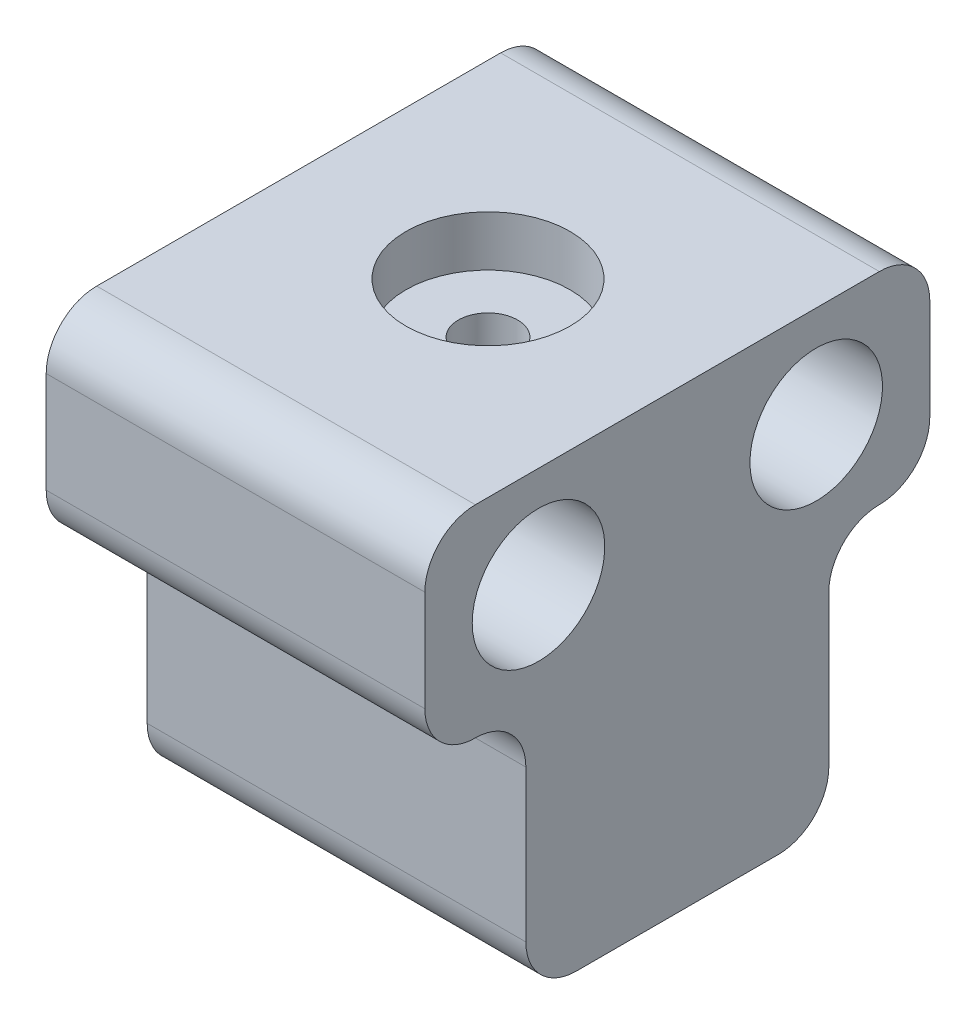
ISO-10303-21;
HEADER;
FILE_DESCRIPTION(('STEP AP214'),'2;1');
FILE_NAME('part.step','',(''),(''),'','','');
FILE_SCHEMA(('AUTOMOTIVE_DESIGN { 1 0 10303 214 1 1 1 1 }'));
ENDSEC;
DATA;
#1=APPLICATION_CONTEXT('core data for automotive mechanical design processes');
#2=APPLICATION_PROTOCOL_DEFINITION('international standard','automotive_design',2000,#1);
#3=PRODUCT_CONTEXT('',#1,'mechanical');
#4=PRODUCT('Part','Part','',(#3));
#5=PRODUCT_RELATED_PRODUCT_CATEGORY('part','',(#4));
#6=PRODUCT_DEFINITION_FORMATION('','',#4);
#7=PRODUCT_DEFINITION_CONTEXT('part definition',#1,'design');
#8=PRODUCT_DEFINITION('design','',#6,#7);
#9=PRODUCT_DEFINITION_SHAPE('','',#8);
#10=(LENGTH_UNIT() NAMED_UNIT(*) SI_UNIT(.MILLI.,.METRE.));
#11=(NAMED_UNIT(*) PLANE_ANGLE_UNIT() SI_UNIT($,.RADIAN.));
#12=(NAMED_UNIT(*) SI_UNIT($,.STERADIAN.) SOLID_ANGLE_UNIT());
#13=UNCERTAINTY_MEASURE_WITH_UNIT(LENGTH_MEASURE(1.E-05),#10,'distance_accuracy_value','');
#14=(GEOMETRIC_REPRESENTATION_CONTEXT(3) GLOBAL_UNCERTAINTY_ASSIGNED_CONTEXT((#13)) GLOBAL_UNIT_ASSIGNED_CONTEXT((#10,
#11,#12)) REPRESENTATION_CONTEXT('',''));
#15=CARTESIAN_POINT('',(0.,0.,0.));
#16=DIRECTION('',(0.,0.,1.));
#17=DIRECTION('',(1.,0.,0.));
#18=AXIS2_PLACEMENT_3D('',#15,#16,#17);
#19=CARTESIAN_POINT('',(0.,0.,0.));
#20=DIRECTION('',(0.,1.,0.));
#21=DIRECTION('',(0.,0.,1.));
#22=AXIS2_PLACEMENT_3D('',#19,#20,#21);
#23=PLANE('',#22);
#24=DIRECTION('',(0.,0.,-1.));
#25=VECTOR('',#24,1.);
#26=CARTESIAN_POINT('',(15.,0.,-8.11011904761905));
#27=LINE('',#26,#25);
#28=CARTESIAN_POINT('',(15.,0.,19.8898809523809));
#29=VERTEX_POINT('',#28);
#30=CARTESIAN_POINT('',(15.,0.,3.88988095238095));
#31=VERTEX_POINT('',#30);
#32=EDGE_CURVE('E332',#29,#31,#27,.T.);
#33=ORIENTED_EDGE('',*,*,#32,.F.);
#34=DIRECTION('',(-1.,0.,0.));
#35=VECTOR('',#34,1.);
#36=CARTESIAN_POINT('',(0.,0.,19.889880952381));
#37=LINE('',#36,#35);
#38=CARTESIAN_POINT('',(11.25,0.,19.889880952381));
#39=VERTEX_POINT('',#38);
#40=EDGE_CURVE('E367',#29,#39,#37,.T.);
#41=ORIENTED_EDGE('',*,*,#40,.T.);
#42=DIRECTION('',(0.,0.,1.));
#43=VECTOR('',#42,1.);
#44=CARTESIAN_POINT('',(11.25,0.,21.389880952381));
#45=LINE('',#44,#43);
#46=CARTESIAN_POINT('',(11.25,0.,3.88988095238096));
#47=VERTEX_POINT('',#46);
#48=EDGE_CURVE('E260',#47,#39,#45,.T.);
#49=ORIENTED_EDGE('',*,*,#48,.F.);
#50=DIRECTION('',(-1.,0.,0.));
#51=VECTOR('',#50,1.);
#52=CARTESIAN_POINT('',(0.,0.,3.88988095238096));
#53=LINE('',#52,#51);
#54=EDGE_CURVE('E351',#47,#31,#53,.F.);
#55=ORIENTED_EDGE('',*,*,#54,.T.);
#56=EDGE_LOOP('',(#33,#41,#49,#55));
#57=FACE_BOUND('',#56,.T.);
#58=ADVANCED_FACE('F34',(#57),#23,.F.);
#59=DIRECTION('',(0.,0.,-1.));
#60=VECTOR('',#59,1.);
#61=CARTESIAN_POINT('',(5.5,0.,21.389880952381));
#62=LINE('',#61,#60);
#63=CARTESIAN_POINT('',(5.5,0.,19.8898809523809));
#64=VERTEX_POINT('',#63);
#65=CARTESIAN_POINT('',(5.5,0.,18.389880952381));
#66=VERTEX_POINT('',#65);
#67=EDGE_CURVE('E266',#64,#66,#62,.T.);
#68=ORIENTED_EDGE('',*,*,#67,.F.);
#69=DIRECTION('',(-1.,0.,0.));
#70=VECTOR('',#69,1.);
#71=CARTESIAN_POINT('',(0.,0.,19.889880952381));
#72=LINE('',#71,#70);
#73=CARTESIAN_POINT('',(-5.5,0.,19.889880952381));
#74=VERTEX_POINT('',#73);
#75=EDGE_CURVE('E365',#64,#74,#72,.T.);
#76=ORIENTED_EDGE('',*,*,#75,.T.);
#77=DIRECTION('',(0.,0.,1.));
#78=VECTOR('',#77,1.);
#79=CARTESIAN_POINT('',(-5.5,0.,21.389880952381));
#80=LINE('',#79,#78);
#81=CARTESIAN_POINT('',(-5.5,0.,18.389880952381));
#82=VERTEX_POINT('',#81);
#83=EDGE_CURVE('E270',#82,#74,#80,.T.);
#84=ORIENTED_EDGE('',*,*,#83,.F.);
#85=DIRECTION('',(-1.,0.,0.));
#86=VECTOR('',#85,1.);
#87=CARTESIAN_POINT('',(-5.5,0.,18.389880952381));
#88=LINE('',#87,#86);
#89=EDGE_CURVE('E268',#66,#82,#88,.T.);
#90=ORIENTED_EDGE('',*,*,#89,.F.);
#91=EDGE_LOOP('',(#68,#76,#84,#90));
#92=FACE_BOUND('',#91,.T.);
#93=ADVANCED_FACE('F547',(#92),#23,.F.);
#94=DIRECTION('',(0.,0.,-1.));
#95=VECTOR('',#94,1.);
#96=CARTESIAN_POINT('',(-11.25,0.,21.389880952381));
#97=LINE('',#96,#95);
#98=CARTESIAN_POINT('',(-11.25,0.,19.8898809523809));
#99=VERTEX_POINT('',#98);
#100=CARTESIAN_POINT('',(-11.25,0.,3.88988095238096));
#101=VERTEX_POINT('',#100);
#102=EDGE_CURVE('E246',#99,#101,#97,.T.);
#103=ORIENTED_EDGE('',*,*,#102,.F.);
#104=DIRECTION('',(-1.,0.,0.));
#105=VECTOR('',#104,1.);
#106=CARTESIAN_POINT('',(0.,0.,19.889880952381));
#107=LINE('',#106,#105);
#108=CARTESIAN_POINT('',(-15.,0.,19.8898809523809));
#109=VERTEX_POINT('',#108);
#110=EDGE_CURVE('E363',#99,#109,#107,.T.);
#111=ORIENTED_EDGE('',*,*,#110,.T.);
#112=DIRECTION('',(0.,0.,1.));
#113=VECTOR('',#112,1.);
#114=CARTESIAN_POINT('',(-15.,0.,-8.11011904761905));
#115=LINE('',#114,#113);
#116=CARTESIAN_POINT('',(-15.,0.,3.88988095238096));
#117=VERTEX_POINT('',#116);
#118=EDGE_CURVE('E327',#117,#109,#115,.T.);
#119=ORIENTED_EDGE('',*,*,#118,.F.);
#120=DIRECTION('',(-1.,0.,0.));
#121=VECTOR('',#120,1.);
#122=CARTESIAN_POINT('',(0.,0.,3.88988095238096));
#123=LINE('',#122,#121);
#124=EDGE_CURVE('E361',#117,#101,#123,.F.);
#125=ORIENTED_EDGE('',*,*,#124,.T.);
#126=EDGE_LOOP('',(#103,#111,#119,#125));
#127=FACE_BOUND('',#126,.T.);
#128=ADVANCED_FACE('F563',(#127),#23,.F.);
#129=CARTESIAN_POINT('',(0.,0.,11.889880952381));
#130=DIRECTION('',(0.,1.,0.));
#131=DIRECTION('',(0.,0.,1.));
#132=AXIS2_PLACEMENT_3D('',#129,#130,#131);
#133=CYLINDRICAL_SURFACE('',#132,2.35);
#134=CARTESIAN_POINT('',(0.,22.,11.889880952381));
#135=DIRECTION('',(0.,-1.,0.));
#136=DIRECTION('',(0.,0.,-1.));
#137=AXIS2_PLACEMENT_3D('',#134,#135,#136);
#138=CIRCLE('',#137,2.35);
#139=CARTESIAN_POINT('',(0.,22.,9.53988095238095));
#140=VERTEX_POINT('',#139);
#141=EDGE_CURVE('E278',#140,#140,#138,.T.);
#142=ORIENTED_EDGE('',*,*,#141,.T.);
#143=EDGE_LOOP('',(#142));
#144=FACE_BOUND('',#143,.T.);
#145=CARTESIAN_POINT('',(0.,32.,11.889880952381));
#146=DIRECTION('',(0.,1.,0.));
#147=DIRECTION('',(0.,0.,1.));
#148=AXIS2_PLACEMENT_3D('',#145,#146,#147);
#149=CIRCLE('',#148,2.35);
#150=CARTESIAN_POINT('',(0.,32.,14.239880952381));
#151=VERTEX_POINT('',#150);
#152=EDGE_CURVE('E354',#151,#151,#149,.F.);
#153=ORIENTED_EDGE('',*,*,#152,.F.);
#154=EDGE_LOOP('',(#153));
#155=FACE_BOUND('',#154,.T.);
#156=ADVANCED_FACE('F613',(#144,#155),#133,.F.);
#157=DIRECTION('',(0.,0.,1.));
#158=VECTOR('',#157,1.);
#159=CARTESIAN_POINT('',(-5.5,0.,2.38988095238095));
#160=LINE('',#159,#158);
#161=CARTESIAN_POINT('',(-5.5,0.,3.88988095238096));
#162=VERTEX_POINT('',#161);
#163=CARTESIAN_POINT('',(-5.5,0.,5.38988095238095));
#164=VERTEX_POINT('',#163);
#165=EDGE_CURVE('E234',#162,#164,#160,.T.);
#166=ORIENTED_EDGE('',*,*,#165,.F.);
#167=DIRECTION('',(-1.,0.,0.));
#168=VECTOR('',#167,1.);
#169=CARTESIAN_POINT('',(0.,0.,3.88988095238096));
#170=LINE('',#169,#168);
#171=CARTESIAN_POINT('',(5.5,0.,3.88988095238095));
#172=VERTEX_POINT('',#171);
#173=EDGE_CURVE('E359',#162,#172,#170,.F.);
#174=ORIENTED_EDGE('',*,*,#173,.T.);
#175=DIRECTION('',(0.,0.,-1.));
#176=VECTOR('',#175,1.);
#177=CARTESIAN_POINT('',(5.5,0.,2.38988095238095));
#178=LINE('',#177,#176);
#179=CARTESIAN_POINT('',(5.5,0.,5.38988095238095));
#180=VERTEX_POINT('',#179);
#181=EDGE_CURVE('E258',#180,#172,#178,.T.);
#182=ORIENTED_EDGE('',*,*,#181,.F.);
#183=DIRECTION('',(1.,0.,0.));
#184=VECTOR('',#183,1.);
#185=CARTESIAN_POINT('',(-5.5,0.,5.38988095238095));
#186=LINE('',#185,#184);
#187=EDGE_CURVE('E245',#164,#180,#186,.T.);
#188=ORIENTED_EDGE('',*,*,#187,.F.);
#189=EDGE_LOOP('',(#166,#174,#182,#188));
#190=FACE_BOUND('',#189,.T.);
#191=ADVANCED_FACE('F257',(#190),#23,.F.);
#192=CARTESIAN_POINT('',(-15.,36.,-8.11011904761905));
#193=DIRECTION('',(1.,0.,0.));
#194=DIRECTION('',(0.,0.,-1.));
#195=AXIS2_PLACEMENT_3D('',#192,#193,#194);
#196=PLANE('',#195);
#197=CARTESIAN_POINT('',(-15.,28.,22.889880952381));
#198=DIRECTION('',(-1.,0.,0.));
#199=DIRECTION('',(0.,0.,1.));
#200=AXIS2_PLACEMENT_3D('',#197,#198,#199);
#201=CIRCLE('',#200,5.25);
#202=CARTESIAN_POINT('',(-15.,28.,28.139880952381));
#203=VERTEX_POINT('',#202);
#204=EDGE_CURVE('E474',#203,#203,#201,.T.);
#205=ORIENTED_EDGE('',*,*,#204,.F.);
#206=EDGE_LOOP('',(#205));
#207=FACE_BOUND('',#206,.T.);
#208=CARTESIAN_POINT('',(-15.,28.,0.889880952380954));
#209=DIRECTION('',(-1.,0.,0.));
#210=DIRECTION('',(0.,0.,1.));
#211=AXIS2_PLACEMENT_3D('',#208,#209,#210);
#212=CIRCLE('',#211,5.25);
#213=CARTESIAN_POINT('',(-15.,28.,6.13988095238095));
#214=VERTEX_POINT('',#213);
#215=EDGE_CURVE('E489',#214,#214,#212,.T.);
#216=ORIENTED_EDGE('',*,*,#215,.F.);
#217=EDGE_LOOP('',(#216));
#218=FACE_BOUND('',#217,.T.);
#219=ORIENTED_EDGE('',*,*,#118,.T.);
#220=CARTESIAN_POINT('',(-15.,4.,19.889880952381));
#221=DIRECTION('',(1.,0.,0.));
#222=DIRECTION('',(0.,0.,-1.));
#223=AXIS2_PLACEMENT_3D('',#220,#221,#222);
#224=CIRCLE('',#223,4.);
#225=CARTESIAN_POINT('',(-15.,4.,23.889880952381));
#226=VERTEX_POINT('',#225);
#227=EDGE_CURVE('E396',#109,#226,#224,.F.);
#228=ORIENTED_EDGE('',*,*,#227,.T.);
#229=DIRECTION('',(0.,-1.,0.));
#230=VECTOR('',#229,1.);
#231=CARTESIAN_POINT('',(-15.,0.,23.889880952381));
#232=LINE('',#231,#230);
#233=CARTESIAN_POINT('',(-15.,16.,23.8898809523809));
#234=VERTEX_POINT('',#233);
#235=EDGE_CURVE('E475',#234,#226,#232,.T.);
#236=ORIENTED_EDGE('',*,*,#235,.F.);
#237=CARTESIAN_POINT('',(-15.,16.,27.8898809523809));
#238=DIRECTION('',(1.,0.,0.));
#239=DIRECTION('',(0.,0.,-1.));
#240=AXIS2_PLACEMENT_3D('',#237,#238,#239);
#241=CIRCLE('',#240,4.);
#242=CARTESIAN_POINT('',(-15.,20.,27.889880952381));
#243=VERTEX_POINT('',#242);
#244=EDGE_CURVE('E43',#234,#243,#241,.T.);
#245=ORIENTED_EDGE('',*,*,#244,.T.);
#246=CARTESIAN_POINT('',(-15.,24.,27.889880952381));
#247=DIRECTION('',(1.,0.,0.));
#248=DIRECTION('',(0.,0.,-1.));
#249=AXIS2_PLACEMENT_3D('',#246,#247,#248);
#250=CIRCLE('',#249,4.);
#251=CARTESIAN_POINT('',(-15.,24.,31.889880952381));
#252=VERTEX_POINT('',#251);
#253=EDGE_CURVE('E386',#243,#252,#250,.F.);
#254=ORIENTED_EDGE('',*,*,#253,.T.);
#255=DIRECTION('',(0.,-1.,0.));
#256=VECTOR('',#255,1.);
#257=CARTESIAN_POINT('',(-15.,36.,31.889880952381));
#258=LINE('',#257,#256);
#259=CARTESIAN_POINT('',(-15.,32.,31.889880952381));
#260=VERTEX_POINT('',#259);
#261=EDGE_CURVE('E348',#260,#252,#258,.T.);
#262=ORIENTED_EDGE('',*,*,#261,.F.);
#263=CARTESIAN_POINT('',(-15.,32.,27.889880952381));
#264=DIRECTION('',(1.,0.,0.));
#265=DIRECTION('',(0.,0.,-1.));
#266=AXIS2_PLACEMENT_3D('',#263,#264,#265);
#267=CIRCLE('',#266,4.);
#268=CARTESIAN_POINT('',(-15.,36.,27.8898809523809));
#269=VERTEX_POINT('',#268);
#270=EDGE_CURVE('E388',#260,#269,#267,.F.);
#271=ORIENTED_EDGE('',*,*,#270,.T.);
#272=DIRECTION('',(0.,0.,1.));
#273=VECTOR('',#272,1.);
#274=CARTESIAN_POINT('',(-15.,36.,-8.11011904761905));
#275=LINE('',#274,#273);
#276=CARTESIAN_POINT('',(-15.,36.,-4.11011904761904));
#277=VERTEX_POINT('',#276);
#278=EDGE_CURVE('E328',#277,#269,#275,.T.);
#279=ORIENTED_EDGE('',*,*,#278,.F.);
#280=CARTESIAN_POINT('',(-15.,32.,-4.11011904761904));
#281=DIRECTION('',(1.,0.,0.));
#282=DIRECTION('',(0.,0.,-1.));
#283=AXIS2_PLACEMENT_3D('',#280,#281,#282);
#284=CIRCLE('',#283,4.);
#285=CARTESIAN_POINT('',(-15.,32.,-8.11011904761905));
#286=VERTEX_POINT('',#285);
#287=EDGE_CURVE('E390',#277,#286,#284,.F.);
#288=ORIENTED_EDGE('',*,*,#287,.T.);
#289=DIRECTION('',(0.,-1.,0.));
#290=VECTOR('',#289,1.);
#291=CARTESIAN_POINT('',(-15.,36.,-8.11011904761905));
#292=LINE('',#291,#290);
#293=CARTESIAN_POINT('',(-15.,24.,-8.11011904761905));
#294=VERTEX_POINT('',#293);
#295=EDGE_CURVE('E335',#286,#294,#292,.T.);
#296=ORIENTED_EDGE('',*,*,#295,.T.);
#297=CARTESIAN_POINT('',(-15.,24.,-4.11011904761904));
#298=DIRECTION('',(1.,0.,0.));
#299=DIRECTION('',(0.,0.,-1.));
#300=AXIS2_PLACEMENT_3D('',#297,#298,#299);
#301=CIRCLE('',#300,4.);
#302=CARTESIAN_POINT('',(-15.,20.,-4.11011904761904));
#303=VERTEX_POINT('',#302);
#304=EDGE_CURVE('E392',#294,#303,#301,.F.);
#305=ORIENTED_EDGE('',*,*,#304,.T.);
#306=CARTESIAN_POINT('',(-15.,16.,-4.11011904761904));
#307=DIRECTION('',(1.,0.,0.));
#308=DIRECTION('',(0.,0.,-1.));
#309=AXIS2_PLACEMENT_3D('',#306,#307,#308);
#310=CIRCLE('',#309,4.);
#311=CARTESIAN_POINT('',(-15.,16.,-0.110119047619045));
#312=VERTEX_POINT('',#311);
#313=EDGE_CURVE('E440',#303,#312,#310,.T.);
#314=ORIENTED_EDGE('',*,*,#313,.T.);
#315=DIRECTION('',(0.,1.,0.));
#316=VECTOR('',#315,1.);
#317=CARTESIAN_POINT('',(-15.,0.,-0.110119047619043));
#318=LINE('',#317,#316);
#319=CARTESIAN_POINT('',(-15.,4.,-0.110119047619043));
#320=VERTEX_POINT('',#319);
#321=EDGE_CURVE('E446',#320,#312,#318,.T.);
#322=ORIENTED_EDGE('',*,*,#321,.F.);
#323=CARTESIAN_POINT('',(-15.,4.,3.88988095238096));
#324=DIRECTION('',(1.,0.,0.));
#325=DIRECTION('',(0.,0.,-1.));
#326=AXIS2_PLACEMENT_3D('',#323,#324,#325);
#327=CIRCLE('',#326,4.);
#328=EDGE_CURVE('E394',#320,#117,#327,.F.);
#329=ORIENTED_EDGE('',*,*,#328,.T.);
#330=EDGE_LOOP('',(#219,#228,#236,#245,#254,#262,#271,#279,#288,#296,#305,#314,#322,#329));
#331=FACE_BOUND('',#330,.T.);
#332=ADVANCED_FACE('F565',(#207,#218,#331),#196,.F.);
#333=CARTESIAN_POINT('',(-15.,36.,31.889880952381));
#334=DIRECTION('',(0.,0.,-1.));
#335=DIRECTION('',(-1.,0.,0.));
#336=AXIS2_PLACEMENT_3D('',#333,#334,#335);
#337=PLANE('',#336);
#338=DIRECTION('',(0.,-1.,0.));
#339=VECTOR('',#338,1.);
#340=CARTESIAN_POINT('',(15.,36.,31.889880952381));
#341=LINE('',#340,#339);
#342=CARTESIAN_POINT('',(15.,32.,31.889880952381));
#343=VERTEX_POINT('',#342);
#344=CARTESIAN_POINT('',(15.,24.,31.889880952381));
#345=VERTEX_POINT('',#344);
#346=EDGE_CURVE('E345',#343,#345,#341,.T.);
#347=ORIENTED_EDGE('',*,*,#346,.F.);
#348=DIRECTION('',(1.,0.,0.));
#349=VECTOR('',#348,1.);
#350=CARTESIAN_POINT('',(-15.,32.,31.889880952381));
#351=LINE('',#350,#349);
#352=EDGE_CURVE('E438',#343,#260,#351,.F.);
#353=ORIENTED_EDGE('',*,*,#352,.T.);
#354=ORIENTED_EDGE('',*,*,#261,.T.);
#355=DIRECTION('',(-1.,0.,0.));
#356=VECTOR('',#355,1.);
#357=CARTESIAN_POINT('',(-15.,24.,31.889880952381));
#358=LINE('',#357,#356);
#359=EDGE_CURVE('E435',#252,#345,#358,.F.);
#360=ORIENTED_EDGE('',*,*,#359,.T.);
#361=EDGE_LOOP('',(#347,#353,#354,#360));
#362=FACE_BOUND('',#361,.T.);
#363=ADVANCED_FACE('F593',(#362),#337,.F.);
#364=CARTESIAN_POINT('',(15.,36.,-8.11011904761905));
#365=DIRECTION('',(-1.,0.,0.));
#366=DIRECTION('',(0.,0.,1.));
#367=AXIS2_PLACEMENT_3D('',#364,#365,#366);
#368=PLANE('',#367);
#369=CARTESIAN_POINT('',(15.,28.,22.8898809523809));
#370=DIRECTION('',(-1.,0.,0.));
#371=DIRECTION('',(0.,0.,1.));
#372=AXIS2_PLACEMENT_3D('',#369,#370,#371);
#373=CIRCLE('',#372,5.25);
#374=CARTESIAN_POINT('',(15.,28.,28.139880952381));
#375=VERTEX_POINT('',#374);
#376=EDGE_CURVE('E478',#375,#375,#373,.T.);
#377=ORIENTED_EDGE('',*,*,#376,.T.);
#378=EDGE_LOOP('',(#377));
#379=FACE_BOUND('',#378,.T.);
#380=CARTESIAN_POINT('',(15.,28.,0.889880952380951));
#381=DIRECTION('',(-1.,0.,0.));
#382=DIRECTION('',(0.,0.,1.));
#383=AXIS2_PLACEMENT_3D('',#380,#381,#382);
#384=CIRCLE('',#383,5.25);
#385=CARTESIAN_POINT('',(15.,28.,6.13988095238095));
#386=VERTEX_POINT('',#385);
#387=EDGE_CURVE('E485',#386,#386,#384,.T.);
#388=ORIENTED_EDGE('',*,*,#387,.T.);
#389=EDGE_LOOP('',(#388));
#390=FACE_BOUND('',#389,.T.);
#391=DIRECTION('',(0.,-1.,0.));
#392=VECTOR('',#391,1.);
#393=CARTESIAN_POINT('',(15.,0.,23.889880952381));
#394=LINE('',#393,#392);
#395=CARTESIAN_POINT('',(15.,16.,23.8898809523809));
#396=VERTEX_POINT('',#395);
#397=CARTESIAN_POINT('',(15.,4.,23.889880952381));
#398=VERTEX_POINT('',#397);
#399=EDGE_CURVE('E467',#396,#398,#394,.T.);
#400=ORIENTED_EDGE('',*,*,#399,.T.);
#401=CARTESIAN_POINT('',(15.,4.,19.889880952381));
#402=DIRECTION('',(-1.,0.,0.));
#403=DIRECTION('',(0.,0.,1.));
#404=AXIS2_PLACEMENT_3D('',#401,#402,#403);
#405=CIRCLE('',#404,4.);
#406=EDGE_CURVE('E412',#398,#29,#405,.F.);
#407=ORIENTED_EDGE('',*,*,#406,.T.);
#408=ORIENTED_EDGE('',*,*,#32,.T.);
#409=CARTESIAN_POINT('',(15.,4.,3.88988095238095));
#410=DIRECTION('',(-1.,0.,0.));
#411=DIRECTION('',(0.,0.,1.));
#412=AXIS2_PLACEMENT_3D('',#409,#410,#411);
#413=CIRCLE('',#412,4.);
#414=CARTESIAN_POINT('',(15.,4.,-0.110119047619046));
#415=VERTEX_POINT('',#414);
#416=EDGE_CURVE('E410',#31,#415,#413,.F.);
#417=ORIENTED_EDGE('',*,*,#416,.T.);
#418=DIRECTION('',(0.,1.,0.));
#419=VECTOR('',#418,1.);
#420=CARTESIAN_POINT('',(15.,0.,-0.110119047619046));
#421=LINE('',#420,#419);
#422=CARTESIAN_POINT('',(15.,16.,-0.110119047619047));
#423=VERTEX_POINT('',#422);
#424=EDGE_CURVE('E451',#415,#423,#421,.T.);
#425=ORIENTED_EDGE('',*,*,#424,.T.);
#426=CARTESIAN_POINT('',(15.,16.,-4.11011904761905));
#427=DIRECTION('',(-1.,0.,0.));
#428=DIRECTION('',(0.,0.,1.));
#429=AXIS2_PLACEMENT_3D('',#426,#427,#428);
#430=CIRCLE('',#429,4.);
#431=CARTESIAN_POINT('',(15.,20.,-4.11011904761904));
#432=VERTEX_POINT('',#431);
#433=EDGE_CURVE('E442',#423,#432,#430,.T.);
#434=ORIENTED_EDGE('',*,*,#433,.T.);
#435=CARTESIAN_POINT('',(15.,24.,-4.11011904761904));
#436=DIRECTION('',(-1.,0.,0.));
#437=DIRECTION('',(0.,0.,1.));
#438=AXIS2_PLACEMENT_3D('',#435,#436,#437);
#439=CIRCLE('',#438,4.);
#440=CARTESIAN_POINT('',(15.,24.,-8.11011904761905));
#441=VERTEX_POINT('',#440);
#442=EDGE_CURVE('E408',#432,#441,#439,.F.);
#443=ORIENTED_EDGE('',*,*,#442,.T.);
#444=DIRECTION('',(0.,-1.,0.));
#445=VECTOR('',#444,1.);
#446=CARTESIAN_POINT('',(15.,36.,-8.11011904761905));
#447=LINE('',#446,#445);
#448=CARTESIAN_POINT('',(15.,32.,-8.11011904761905));
#449=VERTEX_POINT('',#448);
#450=EDGE_CURVE('E342',#449,#441,#447,.T.);
#451=ORIENTED_EDGE('',*,*,#450,.F.);
#452=CARTESIAN_POINT('',(15.,32.,-4.11011904761904));
#453=DIRECTION('',(-1.,0.,0.));
#454=DIRECTION('',(0.,0.,1.));
#455=AXIS2_PLACEMENT_3D('',#452,#453,#454);
#456=CIRCLE('',#455,4.);
#457=CARTESIAN_POINT('',(15.,36.,-4.11011904761904));
#458=VERTEX_POINT('',#457);
#459=EDGE_CURVE('E406',#449,#458,#456,.F.);
#460=ORIENTED_EDGE('',*,*,#459,.T.);
#461=DIRECTION('',(0.,0.,-1.));
#462=VECTOR('',#461,1.);
#463=CARTESIAN_POINT('',(15.,36.,-8.11011904761905));
#464=LINE('',#463,#462);
#465=CARTESIAN_POINT('',(15.,36.,27.8898809523809));
#466=VERTEX_POINT('',#465);
#467=EDGE_CURVE('E331',#466,#458,#464,.T.);
#468=ORIENTED_EDGE('',*,*,#467,.F.);
#469=CARTESIAN_POINT('',(15.,32.,27.889880952381));
#470=DIRECTION('',(-1.,0.,0.));
#471=DIRECTION('',(0.,0.,1.));
#472=AXIS2_PLACEMENT_3D('',#469,#470,#471);
#473=CIRCLE('',#472,4.);
#474=EDGE_CURVE('E404',#466,#343,#473,.F.);
#475=ORIENTED_EDGE('',*,*,#474,.T.);
#476=ORIENTED_EDGE('',*,*,#346,.T.);
#477=CARTESIAN_POINT('',(15.,24.,27.889880952381));
#478=DIRECTION('',(-1.,0.,0.));
#479=DIRECTION('',(0.,0.,1.));
#480=AXIS2_PLACEMENT_3D('',#477,#478,#479);
#481=CIRCLE('',#480,4.);
#482=CARTESIAN_POINT('',(15.,20.,27.889880952381));
#483=VERTEX_POINT('',#482);
#484=EDGE_CURVE('E402',#345,#483,#481,.F.);
#485=ORIENTED_EDGE('',*,*,#484,.T.);
#486=CARTESIAN_POINT('',(15.,16.,27.8898809523809));
#487=DIRECTION('',(-1.,0.,0.));
#488=DIRECTION('',(0.,0.,1.));
#489=AXIS2_PLACEMENT_3D('',#486,#487,#488);
#490=CIRCLE('',#489,4.);
#491=EDGE_CURVE('E11',#483,#396,#490,.T.);
#492=ORIENTED_EDGE('',*,*,#491,.T.);
#493=EDGE_LOOP('',(#400,#407,#408,#417,#425,#434,#443,#451,#460,#468,#475,#476,#485,#492));
#494=FACE_BOUND('',#493,.T.);
#495=ADVANCED_FACE('F466',(#379,#390,#494),#368,.F.);
#496=CARTESIAN_POINT('',(-15.,36.,-8.11011904761905));
#497=DIRECTION('',(0.,0.,1.));
#498=DIRECTION('',(1.,0.,0.));
#499=AXIS2_PLACEMENT_3D('',#496,#497,#498);
#500=PLANE('',#499);
#501=ORIENTED_EDGE('',*,*,#450,.T.);
#502=DIRECTION('',(-1.,0.,0.));
#503=VECTOR('',#502,1.);
#504=CARTESIAN_POINT('',(-15.,24.,-8.11011904761905));
#505=LINE('',#504,#503);
#506=EDGE_CURVE('E427',#441,#294,#505,.T.);
#507=ORIENTED_EDGE('',*,*,#506,.T.);
#508=ORIENTED_EDGE('',*,*,#295,.F.);
#509=DIRECTION('',(-1.,0.,0.));
#510=VECTOR('',#509,1.);
#511=CARTESIAN_POINT('',(15.,32.,-8.11011904761905));
#512=LINE('',#511,#510);
#513=EDGE_CURVE('E425',#286,#449,#512,.F.);
#514=ORIENTED_EDGE('',*,*,#513,.T.);
#515=EDGE_LOOP('',(#501,#507,#508,#514));
#516=FACE_BOUND('',#515,.T.);
#517=ADVANCED_FACE('F578',(#516),#500,.F.);
#518=CARTESIAN_POINT('',(0.,36.,0.));
#519=DIRECTION('',(0.,1.,0.));
#520=DIRECTION('',(0.,0.,1.));
#521=AXIS2_PLACEMENT_3D('',#518,#519,#520);
#522=PLANE('',#521);
#523=CARTESIAN_POINT('',(0.,36.,11.889880952381));
#524=DIRECTION('',(0.,1.,0.));
#525=DIRECTION('',(0.,0.,1.));
#526=AXIS2_PLACEMENT_3D('',#523,#524,#525);
#527=CIRCLE('',#526,6.5);
#528=CARTESIAN_POINT('',(0.,36.,18.389880952381));
#529=VERTEX_POINT('',#528);
#530=EDGE_CURVE('E488',#529,#529,#527,.T.);
#531=ORIENTED_EDGE('',*,*,#530,.F.);
#532=EDGE_LOOP('',(#531));
#533=FACE_BOUND('',#532,.T.);
#534=ORIENTED_EDGE('',*,*,#467,.T.);
#535=DIRECTION('',(-1.,0.,0.));
#536=VECTOR('',#535,1.);
#537=CARTESIAN_POINT('',(-15.,36.,-4.11011904761904));
#538=LINE('',#537,#536);
#539=EDGE_CURVE('E432',#458,#277,#538,.T.);
#540=ORIENTED_EDGE('',*,*,#539,.T.);
#541=ORIENTED_EDGE('',*,*,#278,.T.);
#542=DIRECTION('',(1.,0.,0.));
#543=VECTOR('',#542,1.);
#544=CARTESIAN_POINT('',(15.,36.,27.889880952381));
#545=LINE('',#544,#543);
#546=EDGE_CURVE('E429',#269,#466,#545,.T.);
#547=ORIENTED_EDGE('',*,*,#546,.T.);
#548=EDGE_LOOP('',(#534,#540,#541,#547));
#549=FACE_BOUND('',#548,.T.);
#550=ADVANCED_FACE('F586',(#533,#549),#522,.T.);
#551=CARTESIAN_POINT('',(-11.25,0.,21.389880952381));
#552=DIRECTION('',(1.,0.,0.));
#553=DIRECTION('',(0.,0.,-1.));
#554=AXIS2_PLACEMENT_3D('',#551,#552,#553);
#555=PLANE('',#554);
#556=DIRECTION('',(0.,1.,0.));
#557=VECTOR('',#556,1.);
#558=CARTESIAN_POINT('',(-11.25,0.,21.389880952381));
#559=LINE('',#558,#557);
#560=CARTESIAN_POINT('',(-11.25,0.291900756452168,21.389880952381));
#561=VERTEX_POINT('',#560);
#562=CARTESIAN_POINT('',(-11.25,22.,21.389880952381));
#563=VERTEX_POINT('',#562);
#564=EDGE_CURVE('E273',#561,#563,#559,.T.);
#565=ORIENTED_EDGE('',*,*,#564,.F.);
#566=CARTESIAN_POINT('',(-11.25,4.,19.889880952381));
#567=DIRECTION('',(1.,0.,0.));
#568=DIRECTION('',(0.,0.,-1.));
#569=AXIS2_PLACEMENT_3D('',#566,#567,#568);
#570=CIRCLE('',#569,4.);
#571=EDGE_CURVE('E384',#561,#99,#570,.T.);
#572=ORIENTED_EDGE('',*,*,#571,.T.);
#573=ORIENTED_EDGE('',*,*,#102,.T.);
#574=CARTESIAN_POINT('',(-11.25,4.,3.88988095238096));
#575=DIRECTION('',(1.,0.,0.));
#576=DIRECTION('',(0.,0.,-1.));
#577=AXIS2_PLACEMENT_3D('',#574,#575,#576);
#578=CIRCLE('',#577,4.);
#579=CARTESIAN_POINT('',(-11.25,0.29190075645217,2.38988095238095));
#580=VERTEX_POINT('',#579);
#581=EDGE_CURVE('E382',#101,#580,#578,.T.);
#582=ORIENTED_EDGE('',*,*,#581,.T.);
#583=DIRECTION('',(0.,1.,0.));
#584=VECTOR('',#583,1.);
#585=CARTESIAN_POINT('',(-11.25,0.,2.38988095238095));
#586=LINE('',#585,#584);
#587=CARTESIAN_POINT('',(-11.25,22.,2.38988095238095));
#588=VERTEX_POINT('',#587);
#589=EDGE_CURVE('E325',#580,#588,#586,.T.);
#590=ORIENTED_EDGE('',*,*,#589,.T.);
#591=DIRECTION('',(0.,0.,-1.));
#592=VECTOR('',#591,1.);
#593=CARTESIAN_POINT('',(-11.25,22.,21.389880952381));
#594=LINE('',#593,#592);
#595=EDGE_CURVE('E274',#563,#588,#594,.T.);
#596=ORIENTED_EDGE('',*,*,#595,.F.);
#597=EDGE_LOOP('',(#565,#572,#573,#582,#590,#596));
#598=FACE_BOUND('',#597,.T.);
#599=ADVANCED_FACE('F500',(#598),#555,.T.);
#600=CARTESIAN_POINT('',(-11.25,0.,2.38988095238095));
#601=DIRECTION('',(0.,0.,1.));
#602=DIRECTION('',(1.,0.,0.));
#603=AXIS2_PLACEMENT_3D('',#600,#601,#602);
#604=PLANE('',#603);
#605=ORIENTED_EDGE('',*,*,#589,.F.);
#606=DIRECTION('',(-1.,0.,0.));
#607=VECTOR('',#606,1.);
#608=CARTESIAN_POINT('',(-11.25,0.29190075645217,2.38988095238095));
#609=LINE('',#608,#607);
#610=CARTESIAN_POINT('',(-5.5,0.29190075645217,2.38988095238095));
#611=VERTEX_POINT('',#610);
#612=EDGE_CURVE('E59',#580,#611,#609,.F.);
#613=ORIENTED_EDGE('',*,*,#612,.T.);
#614=DIRECTION('',(0.,1.,0.));
#615=VECTOR('',#614,1.);
#616=CARTESIAN_POINT('',(-5.5,0.,2.38988095238095));
#617=LINE('',#616,#615);
#618=CARTESIAN_POINT('',(-5.5,22.,2.38988095238095));
#619=VERTEX_POINT('',#618);
#620=EDGE_CURVE('E253',#611,#619,#617,.T.);
#621=ORIENTED_EDGE('',*,*,#620,.T.);
#622=DIRECTION('',(1.,0.,0.));
#623=VECTOR('',#622,1.);
#624=CARTESIAN_POINT('',(-11.25,22.,2.38988095238095));
#625=LINE('',#624,#623);
#626=EDGE_CURVE('E277',#588,#619,#625,.T.);
#627=ORIENTED_EDGE('',*,*,#626,.F.);
#628=EDGE_LOOP('',(#605,#613,#621,#627));
#629=FACE_BOUND('',#628,.T.);
#630=ADVANCED_FACE('F763',(#629),#604,.T.);
#631=CARTESIAN_POINT('',(-5.5,0.,2.38988095238095));
#632=DIRECTION('',(-1.,0.,0.));
#633=DIRECTION('',(0.,0.,1.));
#634=AXIS2_PLACEMENT_3D('',#631,#632,#633);
#635=PLANE('',#634);
#636=ORIENTED_EDGE('',*,*,#620,.F.);
#637=CARTESIAN_POINT('',(-5.5,4.,3.88988095238096));
#638=DIRECTION('',(-1.,0.,0.));
#639=DIRECTION('',(0.,0.,1.));
#640=AXIS2_PLACEMENT_3D('',#637,#638,#639);
#641=CIRCLE('',#640,4.);
#642=EDGE_CURVE('E241',#611,#162,#641,.T.);
#643=ORIENTED_EDGE('',*,*,#642,.T.);
#644=ORIENTED_EDGE('',*,*,#165,.T.);
#645=DIRECTION('',(0.,1.,0.));
#646=VECTOR('',#645,1.);
#647=CARTESIAN_POINT('',(-5.5,0.,5.38988095238095));
#648=LINE('',#647,#646);
#649=CARTESIAN_POINT('',(-5.5,22.,5.38988095238095));
#650=VERTEX_POINT('',#649);
#651=EDGE_CURVE('E238',#164,#650,#648,.T.);
#652=ORIENTED_EDGE('',*,*,#651,.T.);
#653=DIRECTION('',(0.,0.,1.));
#654=VECTOR('',#653,1.);
#655=CARTESIAN_POINT('',(-5.5,22.,2.38988095238095));
#656=LINE('',#655,#654);
#657=EDGE_CURVE('E281',#619,#650,#656,.T.);
#658=ORIENTED_EDGE('',*,*,#657,.F.);
#659=EDGE_LOOP('',(#636,#643,#644,#652,#658));
#660=FACE_BOUND('',#659,.T.);
#661=ADVANCED_FACE('F236',(#660),#635,.T.);
#662=CARTESIAN_POINT('',(-5.5,0.,5.38988095238095));
#663=DIRECTION('',(0.,0.,1.));
#664=DIRECTION('',(1.,0.,0.));
#665=AXIS2_PLACEMENT_3D('',#662,#663,#664);
#666=PLANE('',#665);
#667=DIRECTION('',(1.,0.,0.));
#668=VECTOR('',#667,1.);
#669=CARTESIAN_POINT('',(-5.5,22.,5.38988095238095));
#670=LINE('',#669,#668);
#671=CARTESIAN_POINT('',(5.5,22.,5.38988095238095));
#672=VERTEX_POINT('',#671);
#673=EDGE_CURVE('E252',#650,#672,#670,.T.);
#674=ORIENTED_EDGE('',*,*,#673,.F.);
#675=ORIENTED_EDGE('',*,*,#651,.F.);
#676=ORIENTED_EDGE('',*,*,#187,.T.);
#677=DIRECTION('',(0.,1.,0.));
#678=VECTOR('',#677,1.);
#679=CARTESIAN_POINT('',(5.5,0.,5.38988095238095));
#680=LINE('',#679,#678);
#681=EDGE_CURVE('E254',#180,#672,#680,.T.);
#682=ORIENTED_EDGE('',*,*,#681,.T.);
#683=EDGE_LOOP('',(#674,#675,#676,#682));
#684=FACE_BOUND('',#683,.T.);
#685=ADVANCED_FACE('F249',(#684),#666,.T.);
#686=CARTESIAN_POINT('',(5.5,0.,2.38988095238095));
#687=DIRECTION('',(1.,0.,0.));
#688=DIRECTION('',(0.,0.,-1.));
#689=AXIS2_PLACEMENT_3D('',#686,#687,#688);
#690=PLANE('',#689);
#691=ORIENTED_EDGE('',*,*,#181,.T.);
#692=CARTESIAN_POINT('',(5.5,4.,3.88988095238095));
#693=DIRECTION('',(1.,0.,0.));
#694=DIRECTION('',(0.,0.,-1.));
#695=AXIS2_PLACEMENT_3D('',#692,#693,#694);
#696=CIRCLE('',#695,4.);
#697=CARTESIAN_POINT('',(5.5,0.29190075645217,2.38988095238095));
#698=VERTEX_POINT('',#697);
#699=EDGE_CURVE('E51',#172,#698,#696,.T.);
#700=ORIENTED_EDGE('',*,*,#699,.T.);
#701=DIRECTION('',(0.,1.,0.));
#702=VECTOR('',#701,1.);
#703=CARTESIAN_POINT('',(5.5,0.,2.38988095238095));
#704=LINE('',#703,#702);
#705=CARTESIAN_POINT('',(5.5,22.,2.38988095238095));
#706=VERTEX_POINT('',#705);
#707=EDGE_CURVE('E321',#698,#706,#704,.T.);
#708=ORIENTED_EDGE('',*,*,#707,.T.);
#709=DIRECTION('',(0.,0.,-1.));
#710=VECTOR('',#709,1.);
#711=CARTESIAN_POINT('',(5.5,22.,2.38988095238095));
#712=LINE('',#711,#710);
#713=EDGE_CURVE('E284',#672,#706,#712,.T.);
#714=ORIENTED_EDGE('',*,*,#713,.F.);
#715=ORIENTED_EDGE('',*,*,#681,.F.);
#716=EDGE_LOOP('',(#691,#700,#708,#714,#715));
#717=FACE_BOUND('',#716,.T.);
#718=ADVANCED_FACE('F508',(#717),#690,.T.);
#719=CARTESIAN_POINT('',(5.5,0.,2.38988095238095));
#720=DIRECTION('',(0.,0.,1.));
#721=DIRECTION('',(1.,0.,0.));
#722=AXIS2_PLACEMENT_3D('',#719,#720,#721);
#723=PLANE('',#722);
#724=ORIENTED_EDGE('',*,*,#707,.F.);
#725=DIRECTION('',(-1.,0.,0.));
#726=VECTOR('',#725,1.);
#727=CARTESIAN_POINT('',(5.5,0.291900756452169,2.38988095238095));
#728=LINE('',#727,#726);
#729=CARTESIAN_POINT('',(11.25,0.29190075645217,2.38988095238095));
#730=VERTEX_POINT('',#729);
#731=EDGE_CURVE('E423',#698,#730,#728,.F.);
#732=ORIENTED_EDGE('',*,*,#731,.T.);
#733=DIRECTION('',(0.,1.,0.));
#734=VECTOR('',#733,1.);
#735=CARTESIAN_POINT('',(11.25,0.,2.38988095238095));
#736=LINE('',#735,#734);
#737=CARTESIAN_POINT('',(11.25,22.,2.38988095238095));
#738=VERTEX_POINT('',#737);
#739=EDGE_CURVE('E319',#730,#738,#736,.T.);
#740=ORIENTED_EDGE('',*,*,#739,.T.);
#741=DIRECTION('',(1.,0.,0.));
#742=VECTOR('',#741,1.);
#743=CARTESIAN_POINT('',(5.5,22.,2.38988095238095));
#744=LINE('',#743,#742);
#745=EDGE_CURVE('E287',#706,#738,#744,.T.);
#746=ORIENTED_EDGE('',*,*,#745,.F.);
#747=EDGE_LOOP('',(#724,#732,#740,#746));
#748=FACE_BOUND('',#747,.T.);
#749=ADVANCED_FACE('F515',(#748),#723,.T.);
#750=CARTESIAN_POINT('',(11.25,0.,21.389880952381));
#751=DIRECTION('',(-1.,0.,0.));
#752=DIRECTION('',(0.,0.,1.));
#753=AXIS2_PLACEMENT_3D('',#750,#751,#752);
#754=PLANE('',#753);
#755=ORIENTED_EDGE('',*,*,#48,.T.);
#756=CARTESIAN_POINT('',(11.25,4.,19.889880952381));
#757=DIRECTION('',(-1.,0.,0.));
#758=DIRECTION('',(0.,0.,1.));
#759=AXIS2_PLACEMENT_3D('',#756,#757,#758);
#760=CIRCLE('',#759,4.);
#761=CARTESIAN_POINT('',(11.25,0.291900756452168,21.389880952381));
#762=VERTEX_POINT('',#761);
#763=EDGE_CURVE('E372',#39,#762,#760,.T.);
#764=ORIENTED_EDGE('',*,*,#763,.T.);
#765=DIRECTION('',(0.,1.,0.));
#766=VECTOR('',#765,1.);
#767=CARTESIAN_POINT('',(11.25,0.,21.389880952381));
#768=LINE('',#767,#766);
#769=CARTESIAN_POINT('',(11.25,22.,21.389880952381));
#770=VERTEX_POINT('',#769);
#771=EDGE_CURVE('E317',#762,#770,#768,.T.);
#772=ORIENTED_EDGE('',*,*,#771,.T.);
#773=DIRECTION('',(0.,0.,1.));
#774=VECTOR('',#773,1.);
#775=CARTESIAN_POINT('',(11.25,22.,21.389880952381));
#776=LINE('',#775,#774);
#777=EDGE_CURVE('E290',#738,#770,#776,.T.);
#778=ORIENTED_EDGE('',*,*,#777,.F.);
#779=ORIENTED_EDGE('',*,*,#739,.F.);
#780=CARTESIAN_POINT('',(11.25,4.,3.88988095238095));
#781=DIRECTION('',(-1.,0.,0.));
#782=DIRECTION('',(0.,0.,1.));
#783=AXIS2_PLACEMENT_3D('',#780,#781,#782);
#784=CIRCLE('',#783,4.);
#785=EDGE_CURVE('E370',#730,#47,#784,.T.);
#786=ORIENTED_EDGE('',*,*,#785,.T.);
#787=EDGE_LOOP('',(#755,#764,#772,#778,#779,#786));
#788=FACE_BOUND('',#787,.T.);
#789=ADVANCED_FACE('F519',(#788),#754,.T.);
#790=CARTESIAN_POINT('',(5.5,0.,21.389880952381));
#791=DIRECTION('',(0.,0.,-1.));
#792=DIRECTION('',(-1.,0.,0.));
#793=AXIS2_PLACEMENT_3D('',#790,#791,#792);
#794=PLANE('',#793);
#795=ORIENTED_EDGE('',*,*,#771,.F.);
#796=DIRECTION('',(-1.,0.,0.));
#797=VECTOR('',#796,1.);
#798=CARTESIAN_POINT('',(11.25,0.291900756452168,21.389880952381));
#799=LINE('',#798,#797);
#800=CARTESIAN_POINT('',(5.5,0.291900756452168,21.389880952381));
#801=VERTEX_POINT('',#800);
#802=EDGE_CURVE('E374',#762,#801,#799,.T.);
#803=ORIENTED_EDGE('',*,*,#802,.T.);
#804=DIRECTION('',(0.,1.,0.));
#805=VECTOR('',#804,1.);
#806=CARTESIAN_POINT('',(5.5,0.,21.389880952381));
#807=LINE('',#806,#805);
#808=CARTESIAN_POINT('',(5.5,22.,21.389880952381));
#809=VERTEX_POINT('',#808);
#810=EDGE_CURVE('E315',#801,#809,#807,.T.);
#811=ORIENTED_EDGE('',*,*,#810,.T.);
#812=DIRECTION('',(-1.,0.,0.));
#813=VECTOR('',#812,1.);
#814=CARTESIAN_POINT('',(5.5,22.,21.389880952381));
#815=LINE('',#814,#813);
#816=EDGE_CURVE('E293',#770,#809,#815,.T.);
#817=ORIENTED_EDGE('',*,*,#816,.F.);
#818=EDGE_LOOP('',(#795,#803,#811,#817));
#819=FACE_BOUND('',#818,.T.);
#820=ADVANCED_FACE('F535',(#819),#794,.T.);
#821=CARTESIAN_POINT('',(5.5,0.,21.389880952381));
#822=DIRECTION('',(1.,0.,0.));
#823=DIRECTION('',(0.,0.,-1.));
#824=AXIS2_PLACEMENT_3D('',#821,#822,#823);
#825=PLANE('',#824);
#826=ORIENTED_EDGE('',*,*,#810,.F.);
#827=CARTESIAN_POINT('',(5.5,4.,19.889880952381));
#828=DIRECTION('',(1.,0.,0.));
#829=DIRECTION('',(0.,0.,-1.));
#830=AXIS2_PLACEMENT_3D('',#827,#828,#829);
#831=CIRCLE('',#830,4.);
#832=EDGE_CURVE('E376',#801,#64,#831,.T.);
#833=ORIENTED_EDGE('',*,*,#832,.T.);
#834=ORIENTED_EDGE('',*,*,#67,.T.);
#835=DIRECTION('',(0.,1.,0.));
#836=VECTOR('',#835,1.);
#837=CARTESIAN_POINT('',(5.5,0.,18.389880952381));
#838=LINE('',#837,#836);
#839=CARTESIAN_POINT('',(5.5,22.,18.389880952381));
#840=VERTEX_POINT('',#839);
#841=EDGE_CURVE('E312',#66,#840,#838,.T.);
#842=ORIENTED_EDGE('',*,*,#841,.T.);
#843=DIRECTION('',(0.,0.,-1.));
#844=VECTOR('',#843,1.);
#845=CARTESIAN_POINT('',(5.5,22.,21.389880952381));
#846=LINE('',#845,#844);
#847=EDGE_CURVE('E296',#809,#840,#846,.T.);
#848=ORIENTED_EDGE('',*,*,#847,.F.);
#849=EDGE_LOOP('',(#826,#833,#834,#842,#848));
#850=FACE_BOUND('',#849,.T.);
#851=ADVANCED_FACE('F542',(#850),#825,.T.);
#852=CARTESIAN_POINT('',(-5.5,0.,18.389880952381));
#853=DIRECTION('',(0.,0.,-1.));
#854=DIRECTION('',(-1.,0.,0.));
#855=AXIS2_PLACEMENT_3D('',#852,#853,#854);
#856=PLANE('',#855);
#857=DIRECTION('',(-1.,0.,0.));
#858=VECTOR('',#857,1.);
#859=CARTESIAN_POINT('',(-5.5,22.,18.389880952381));
#860=LINE('',#859,#858);
#861=CARTESIAN_POINT('',(-5.5,22.,18.389880952381));
#862=VERTEX_POINT('',#861);
#863=EDGE_CURVE('E298',#840,#862,#860,.T.);
#864=ORIENTED_EDGE('',*,*,#863,.F.);
#865=ORIENTED_EDGE('',*,*,#841,.F.);
#866=ORIENTED_EDGE('',*,*,#89,.T.);
#867=DIRECTION('',(0.,1.,0.));
#868=VECTOR('',#867,1.);
#869=CARTESIAN_POINT('',(-5.5,0.,18.389880952381));
#870=LINE('',#869,#868);
#871=EDGE_CURVE('E309',#82,#862,#870,.T.);
#872=ORIENTED_EDGE('',*,*,#871,.T.);
#873=EDGE_LOOP('',(#864,#865,#866,#872));
#874=FACE_BOUND('',#873,.T.);
#875=ADVANCED_FACE('F552',(#874),#856,.T.);
#876=CARTESIAN_POINT('',(-5.5,0.,21.389880952381));
#877=DIRECTION('',(-1.,0.,0.));
#878=DIRECTION('',(0.,0.,1.));
#879=AXIS2_PLACEMENT_3D('',#876,#877,#878);
#880=PLANE('',#879);
#881=ORIENTED_EDGE('',*,*,#83,.T.);
#882=CARTESIAN_POINT('',(-5.5,4.,19.889880952381));
#883=DIRECTION('',(-1.,0.,0.));
#884=DIRECTION('',(0.,0.,1.));
#885=AXIS2_PLACEMENT_3D('',#882,#883,#884);
#886=CIRCLE('',#885,4.);
#887=CARTESIAN_POINT('',(-5.5,0.291900756452168,21.389880952381));
#888=VERTEX_POINT('',#887);
#889=EDGE_CURVE('E378',#74,#888,#886,.T.);
#890=ORIENTED_EDGE('',*,*,#889,.T.);
#891=DIRECTION('',(0.,1.,0.));
#892=VECTOR('',#891,1.);
#893=CARTESIAN_POINT('',(-5.5,0.,21.389880952381));
#894=LINE('',#893,#892);
#895=CARTESIAN_POINT('',(-5.5,22.,21.389880952381));
#896=VERTEX_POINT('',#895);
#897=EDGE_CURVE('E307',#888,#896,#894,.T.);
#898=ORIENTED_EDGE('',*,*,#897,.T.);
#899=DIRECTION('',(0.,0.,1.));
#900=VECTOR('',#899,1.);
#901=CARTESIAN_POINT('',(-5.5,22.,21.389880952381));
#902=LINE('',#901,#900);
#903=EDGE_CURVE('E300',#862,#896,#902,.T.);
#904=ORIENTED_EDGE('',*,*,#903,.F.);
#905=ORIENTED_EDGE('',*,*,#871,.F.);
#906=EDGE_LOOP('',(#881,#890,#898,#904,#905));
#907=FACE_BOUND('',#906,.T.);
#908=ADVANCED_FACE('F555',(#907),#880,.T.);
#909=CARTESIAN_POINT('',(-11.25,0.,21.389880952381));
#910=DIRECTION('',(0.,0.,-1.));
#911=DIRECTION('',(-1.,0.,0.));
#912=AXIS2_PLACEMENT_3D('',#909,#910,#911);
#913=PLANE('',#912);
#914=ORIENTED_EDGE('',*,*,#897,.F.);
#915=DIRECTION('',(-1.,0.,0.));
#916=VECTOR('',#915,1.);
#917=CARTESIAN_POINT('',(-5.5,0.291900756452168,21.389880952381));
#918=LINE('',#917,#916);
#919=EDGE_CURVE('E380',#888,#561,#918,.T.);
#920=ORIENTED_EDGE('',*,*,#919,.T.);
#921=ORIENTED_EDGE('',*,*,#564,.T.);
#922=DIRECTION('',(-1.,0.,0.));
#923=VECTOR('',#922,1.);
#924=CARTESIAN_POINT('',(-11.25,22.,21.389880952381));
#925=LINE('',#924,#923);
#926=EDGE_CURVE('E303',#896,#563,#925,.T.);
#927=ORIENTED_EDGE('',*,*,#926,.F.);
#928=EDGE_LOOP('',(#914,#920,#921,#927));
#929=FACE_BOUND('',#928,.T.);
#930=ADVANCED_FACE('F560',(#929),#913,.T.);
#931=CARTESIAN_POINT('',(0.,22.,0.));
#932=DIRECTION('',(0.,-1.,0.));
#933=DIRECTION('',(0.,0.,-1.));
#934=AXIS2_PLACEMENT_3D('',#931,#932,#933);
#935=PLANE('',#934);
#936=ORIENTED_EDGE('',*,*,#141,.F.);
#937=EDGE_LOOP('',(#936));
#938=FACE_BOUND('',#937,.T.);
#939=ORIENTED_EDGE('',*,*,#595,.T.);
#940=ORIENTED_EDGE('',*,*,#626,.T.);
#941=ORIENTED_EDGE('',*,*,#657,.T.);
#942=ORIENTED_EDGE('',*,*,#673,.T.);
#943=ORIENTED_EDGE('',*,*,#713,.T.);
#944=ORIENTED_EDGE('',*,*,#745,.T.);
#945=ORIENTED_EDGE('',*,*,#777,.T.);
#946=ORIENTED_EDGE('',*,*,#816,.T.);
#947=ORIENTED_EDGE('',*,*,#847,.T.);
#948=ORIENTED_EDGE('',*,*,#863,.T.);
#949=ORIENTED_EDGE('',*,*,#903,.T.);
#950=ORIENTED_EDGE('',*,*,#926,.T.);
#951=EDGE_LOOP('',(#939,#940,#941,#942,#943,#944,#945,#946,#947,#948,#949,#950));
#952=FACE_BOUND('',#951,.T.);
#953=ADVANCED_FACE('F512',(#938,#952),#935,.T.);
#954=CARTESIAN_POINT('',(0.,32.,11.889880952381));
#955=DIRECTION('',(0.,1.,0.));
#956=DIRECTION('',(0.,0.,1.));
#957=AXIS2_PLACEMENT_3D('',#954,#955,#956);
#958=PLANE('',#957);
#959=CARTESIAN_POINT('',(0.,32.,11.889880952381));
#960=DIRECTION('',(0.,1.,0.));
#961=DIRECTION('',(0.,0.,1.));
#962=AXIS2_PLACEMENT_3D('',#959,#960,#961);
#963=CIRCLE('',#962,6.5);
#964=CARTESIAN_POINT('',(0.,32.,18.389880952381));
#965=VERTEX_POINT('',#964);
#966=EDGE_CURVE('E357',#965,#965,#963,.T.);
#967=ORIENTED_EDGE('',*,*,#966,.T.);
#968=EDGE_LOOP('',(#967));
#969=FACE_BOUND('',#968,.T.);
#970=ORIENTED_EDGE('',*,*,#152,.T.);
#971=EDGE_LOOP('',(#970));
#972=FACE_BOUND('',#971,.T.);
#973=ADVANCED_FACE('F642',(#969,#972),#958,.T.);
#974=CARTESIAN_POINT('',(0.,32.,11.889880952381));
#975=DIRECTION('',(0.,1.,0.));
#976=DIRECTION('',(0.,0.,1.));
#977=AXIS2_PLACEMENT_3D('',#974,#975,#976);
#978=CYLINDRICAL_SURFACE('',#977,6.5);
#979=ORIENTED_EDGE('',*,*,#966,.F.);
#980=EDGE_LOOP('',(#979));
#981=FACE_BOUND('',#980,.T.);
#982=ORIENTED_EDGE('',*,*,#530,.T.);
#983=EDGE_LOOP('',(#982));
#984=FACE_BOUND('',#983,.T.);
#985=ADVANCED_FACE('F646',(#981,#984),#978,.F.);
#986=CARTESIAN_POINT('',(15.,28.,0.889880952380951));
#987=DIRECTION('',(-1.,0.,0.));
#988=DIRECTION('',(0.,0.,1.));
#989=AXIS2_PLACEMENT_3D('',#986,#987,#988);
#990=CYLINDRICAL_SURFACE('',#989,5.25);
#991=ORIENTED_EDGE('',*,*,#387,.F.);
#992=EDGE_LOOP('',(#991));
#993=FACE_BOUND('',#992,.T.);
#994=ORIENTED_EDGE('',*,*,#215,.T.);
#995=EDGE_LOOP('',(#994));
#996=FACE_BOUND('',#995,.T.);
#997=ADVANCED_FACE('F656',(#993,#996),#990,.F.);
#998=CARTESIAN_POINT('',(15.,0.,-0.110119047619046));
#999=DIRECTION('',(0.,0.,1.));
#1000=DIRECTION('',(0.,-1.,0.));
#1001=AXIS2_PLACEMENT_3D('',#998,#999,#1000);
#1002=PLANE('',#1001);
#1003=ORIENTED_EDGE('',*,*,#424,.F.);
#1004=DIRECTION('',(-1.,0.,0.));
#1005=VECTOR('',#1004,1.);
#1006=CARTESIAN_POINT('',(15.,4.,-0.110119047619046));
#1007=LINE('',#1006,#1005);
#1008=EDGE_CURVE('E417',#415,#320,#1007,.T.);
#1009=ORIENTED_EDGE('',*,*,#1008,.T.);
#1010=ORIENTED_EDGE('',*,*,#321,.T.);
#1011=DIRECTION('',(-1.,0.,0.));
#1012=VECTOR('',#1011,1.);
#1013=CARTESIAN_POINT('',(15.,16.,-0.110119047619047));
#1014=LINE('',#1013,#1012);
#1015=EDGE_CURVE('E414',#312,#423,#1014,.F.);
#1016=ORIENTED_EDGE('',*,*,#1015,.T.);
#1017=EDGE_LOOP('',(#1003,#1009,#1010,#1016));
#1018=FACE_BOUND('',#1017,.T.);
#1019=ADVANCED_FACE('F568',(#1018),#1002,.F.);
#1020=CARTESIAN_POINT('',(15.,0.,23.889880952381));
#1021=DIRECTION('',(0.,0.,-1.));
#1022=DIRECTION('',(0.,1.,0.));
#1023=AXIS2_PLACEMENT_3D('',#1020,#1021,#1022);
#1024=PLANE('',#1023);
#1025=ORIENTED_EDGE('',*,*,#235,.T.);
#1026=DIRECTION('',(-1.,0.,0.));
#1027=VECTOR('',#1026,1.);
#1028=CARTESIAN_POINT('',(15.,4.,23.889880952381));
#1029=LINE('',#1028,#1027);
#1030=EDGE_CURVE('E400',#226,#398,#1029,.F.);
#1031=ORIENTED_EDGE('',*,*,#1030,.T.);
#1032=ORIENTED_EDGE('',*,*,#399,.F.);
#1033=DIRECTION('',(-1.,0.,0.));
#1034=VECTOR('',#1033,1.);
#1035=CARTESIAN_POINT('',(-15.,16.,23.8898809523809));
#1036=LINE('',#1035,#1034);
#1037=EDGE_CURVE('E398',#396,#234,#1036,.T.);
#1038=ORIENTED_EDGE('',*,*,#1037,.T.);
#1039=EDGE_LOOP('',(#1025,#1031,#1032,#1038));
#1040=FACE_BOUND('',#1039,.T.);
#1041=ADVANCED_FACE('F471',(#1040),#1024,.F.);
#1042=CARTESIAN_POINT('',(15.,28.,22.8898809523809));
#1043=DIRECTION('',(-1.,0.,0.));
#1044=DIRECTION('',(0.,0.,1.));
#1045=AXIS2_PLACEMENT_3D('',#1042,#1043,#1044);
#1046=CYLINDRICAL_SURFACE('',#1045,5.25);
#1047=ORIENTED_EDGE('',*,*,#376,.F.);
#1048=EDGE_LOOP('',(#1047));
#1049=FACE_BOUND('',#1048,.T.);
#1050=ORIENTED_EDGE('',*,*,#204,.T.);
#1051=EDGE_LOOP('',(#1050));
#1052=FACE_BOUND('',#1051,.T.);
#1053=ADVANCED_FACE('F673',(#1049,#1052),#1046,.F.);
#1054=CARTESIAN_POINT('',(0.,4.,19.889880952381));
#1055=DIRECTION('',(-1.,0.,0.));
#1056=DIRECTION('',(0.,0.,1.));
#1057=AXIS2_PLACEMENT_3D('',#1054,#1055,#1056);
#1058=CYLINDRICAL_SURFACE('',#1057,4.);
#1059=ORIENTED_EDGE('',*,*,#406,.F.);
#1060=ORIENTED_EDGE('',*,*,#1030,.F.);
#1061=ORIENTED_EDGE('',*,*,#227,.F.);
#1062=ORIENTED_EDGE('',*,*,#110,.F.);
#1063=ORIENTED_EDGE('',*,*,#571,.F.);
#1064=ORIENTED_EDGE('',*,*,#919,.F.);
#1065=ORIENTED_EDGE('',*,*,#889,.F.);
#1066=ORIENTED_EDGE('',*,*,#75,.F.);
#1067=ORIENTED_EDGE('',*,*,#832,.F.);
#1068=ORIENTED_EDGE('',*,*,#802,.F.);
#1069=ORIENTED_EDGE('',*,*,#763,.F.);
#1070=ORIENTED_EDGE('',*,*,#40,.F.);
#1071=EDGE_LOOP('',(#1059,#1060,#1061,#1062,#1063,#1064,#1065,#1066,#1067,#1068,#1069,#1070));
#1072=FACE_BOUND('',#1071,.T.);
#1073=ADVANCED_FACE('F529',(#1072),#1058,.T.);
#1074=CARTESIAN_POINT('',(15.,4.,3.88988095238095));
#1075=DIRECTION('',(-1.,0.,0.));
#1076=DIRECTION('',(0.,0.,1.));
#1077=AXIS2_PLACEMENT_3D('',#1074,#1075,#1076);
#1078=CYLINDRICAL_SURFACE('',#1077,4.);
#1079=ORIENTED_EDGE('',*,*,#581,.F.);
#1080=ORIENTED_EDGE('',*,*,#124,.F.);
#1081=ORIENTED_EDGE('',*,*,#328,.F.);
#1082=ORIENTED_EDGE('',*,*,#1008,.F.);
#1083=ORIENTED_EDGE('',*,*,#416,.F.);
#1084=ORIENTED_EDGE('',*,*,#54,.F.);
#1085=ORIENTED_EDGE('',*,*,#785,.F.);
#1086=ORIENTED_EDGE('',*,*,#731,.F.);
#1087=ORIENTED_EDGE('',*,*,#699,.F.);
#1088=ORIENTED_EDGE('',*,*,#173,.F.);
#1089=ORIENTED_EDGE('',*,*,#642,.F.);
#1090=ORIENTED_EDGE('',*,*,#612,.F.);
#1091=EDGE_LOOP('',(#1079,#1080,#1081,#1082,#1083,#1084,#1085,#1086,#1087,#1088,#1089,#1090));
#1092=FACE_BOUND('',#1091,.T.);
#1093=ADVANCED_FACE('F506',(#1092),#1078,.T.);
#1094=CARTESIAN_POINT('',(-15.,24.,-4.11011904761904));
#1095=DIRECTION('',(-1.,0.,0.));
#1096=DIRECTION('',(0.,0.,1.));
#1097=AXIS2_PLACEMENT_3D('',#1094,#1095,#1096);
#1098=CYLINDRICAL_SURFACE('',#1097,4.);
#1099=ORIENTED_EDGE('',*,*,#506,.F.);
#1100=ORIENTED_EDGE('',*,*,#442,.F.);
#1101=DIRECTION('',(-1.,0.,0.));
#1102=VECTOR('',#1101,1.);
#1103=CARTESIAN_POINT('',(15.,20.,-4.11011904761904));
#1104=LINE('',#1103,#1102);
#1105=EDGE_CURVE('E444',#303,#432,#1104,.F.);
#1106=ORIENTED_EDGE('',*,*,#1105,.F.);
#1107=ORIENTED_EDGE('',*,*,#304,.F.);
#1108=EDGE_LOOP('',(#1099,#1100,#1106,#1107));
#1109=FACE_BOUND('',#1108,.T.);
#1110=ADVANCED_FACE('F574',(#1109),#1098,.T.);
#1111=CARTESIAN_POINT('',(15.,16.,-4.11011904761905));
#1112=DIRECTION('',(1.,0.,0.));
#1113=DIRECTION('',(0.,0.,-1.));
#1114=AXIS2_PLACEMENT_3D('',#1111,#1112,#1113);
#1115=CYLINDRICAL_SURFACE('',#1114,4.);
#1116=ORIENTED_EDGE('',*,*,#433,.F.);
#1117=ORIENTED_EDGE('',*,*,#1015,.F.);
#1118=ORIENTED_EDGE('',*,*,#313,.F.);
#1119=ORIENTED_EDGE('',*,*,#1105,.T.);
#1120=EDGE_LOOP('',(#1116,#1117,#1118,#1119));
#1121=FACE_BOUND('',#1120,.T.);
#1122=ADVANCED_FACE('F603',(#1121),#1115,.F.);
#1123=CARTESIAN_POINT('',(0.,32.,-4.11011904761904));
#1124=DIRECTION('',(1.,0.,0.));
#1125=DIRECTION('',(0.,0.,-1.));
#1126=AXIS2_PLACEMENT_3D('',#1123,#1124,#1125);
#1127=CYLINDRICAL_SURFACE('',#1126,4.);
#1128=ORIENTED_EDGE('',*,*,#459,.F.);
#1129=ORIENTED_EDGE('',*,*,#513,.F.);
#1130=ORIENTED_EDGE('',*,*,#287,.F.);
#1131=ORIENTED_EDGE('',*,*,#539,.F.);
#1132=EDGE_LOOP('',(#1128,#1129,#1130,#1131));
#1133=FACE_BOUND('',#1132,.T.);
#1134=ADVANCED_FACE('F584',(#1133),#1127,.T.);
#1135=CARTESIAN_POINT('',(0.,32.,27.889880952381));
#1136=DIRECTION('',(-1.,0.,0.));
#1137=DIRECTION('',(0.,0.,1.));
#1138=AXIS2_PLACEMENT_3D('',#1135,#1136,#1137);
#1139=CYLINDRICAL_SURFACE('',#1138,4.);
#1140=ORIENTED_EDGE('',*,*,#270,.F.);
#1141=ORIENTED_EDGE('',*,*,#352,.F.);
#1142=ORIENTED_EDGE('',*,*,#474,.F.);
#1143=ORIENTED_EDGE('',*,*,#546,.F.);
#1144=EDGE_LOOP('',(#1140,#1141,#1142,#1143));
#1145=FACE_BOUND('',#1144,.T.);
#1146=ADVANCED_FACE('F596',(#1145),#1139,.T.);
#1147=CARTESIAN_POINT('',(15.,16.,27.8898809523809));
#1148=DIRECTION('',(1.,0.,0.));
#1149=DIRECTION('',(0.,0.,-1.));
#1150=AXIS2_PLACEMENT_3D('',#1147,#1148,#1149);
#1151=CYLINDRICAL_SURFACE('',#1150,4.);
#1152=ORIENTED_EDGE('',*,*,#1037,.F.);
#1153=ORIENTED_EDGE('',*,*,#491,.F.);
#1154=DIRECTION('',(-1.,0.,0.));
#1155=VECTOR('',#1154,1.);
#1156=CARTESIAN_POINT('',(15.,20.,27.8898809523809));
#1157=LINE('',#1156,#1155);
#1158=EDGE_CURVE('E38',#243,#483,#1157,.F.);
#1159=ORIENTED_EDGE('',*,*,#1158,.F.);
#1160=ORIENTED_EDGE('',*,*,#244,.F.);
#1161=EDGE_LOOP('',(#1152,#1153,#1159,#1160));
#1162=FACE_BOUND('',#1161,.T.);
#1163=ADVANCED_FACE('F36',(#1162),#1151,.F.);
#1164=CARTESIAN_POINT('',(15.,24.,27.889880952381));
#1165=DIRECTION('',(-1.,0.,0.));
#1166=DIRECTION('',(0.,0.,1.));
#1167=AXIS2_PLACEMENT_3D('',#1164,#1165,#1166);
#1168=CYLINDRICAL_SURFACE('',#1167,4.);
#1169=ORIENTED_EDGE('',*,*,#484,.F.);
#1170=ORIENTED_EDGE('',*,*,#359,.F.);
#1171=ORIENTED_EDGE('',*,*,#253,.F.);
#1172=ORIENTED_EDGE('',*,*,#1158,.T.);
#1173=EDGE_LOOP('',(#1169,#1170,#1171,#1172));
#1174=FACE_BOUND('',#1173,.T.);
#1175=ADVANCED_FACE('F457',(#1174),#1168,.T.);
#1176=CLOSED_SHELL('',(#58,#93,#128,#156,#191,#332,#363,#495,#517,#550,#599,#630,#661,#685,#718,
#749,#789,#820,#851,#875,#908,#930,#953,#973,#985,#997,#1019,#1041,#1053,#1073,#1093,#1110,
#1122,#1134,#1146,#1163,#1175));
#1177=MANIFOLD_SOLID_BREP('B2',#1176);
#1178=ADVANCED_BREP_SHAPE_REPRESENTATION('',(#18,#1177),#14);
#1179=SHAPE_DEFINITION_REPRESENTATION(#9,#1178);
ENDSEC;
END-ISO-10303-21;
